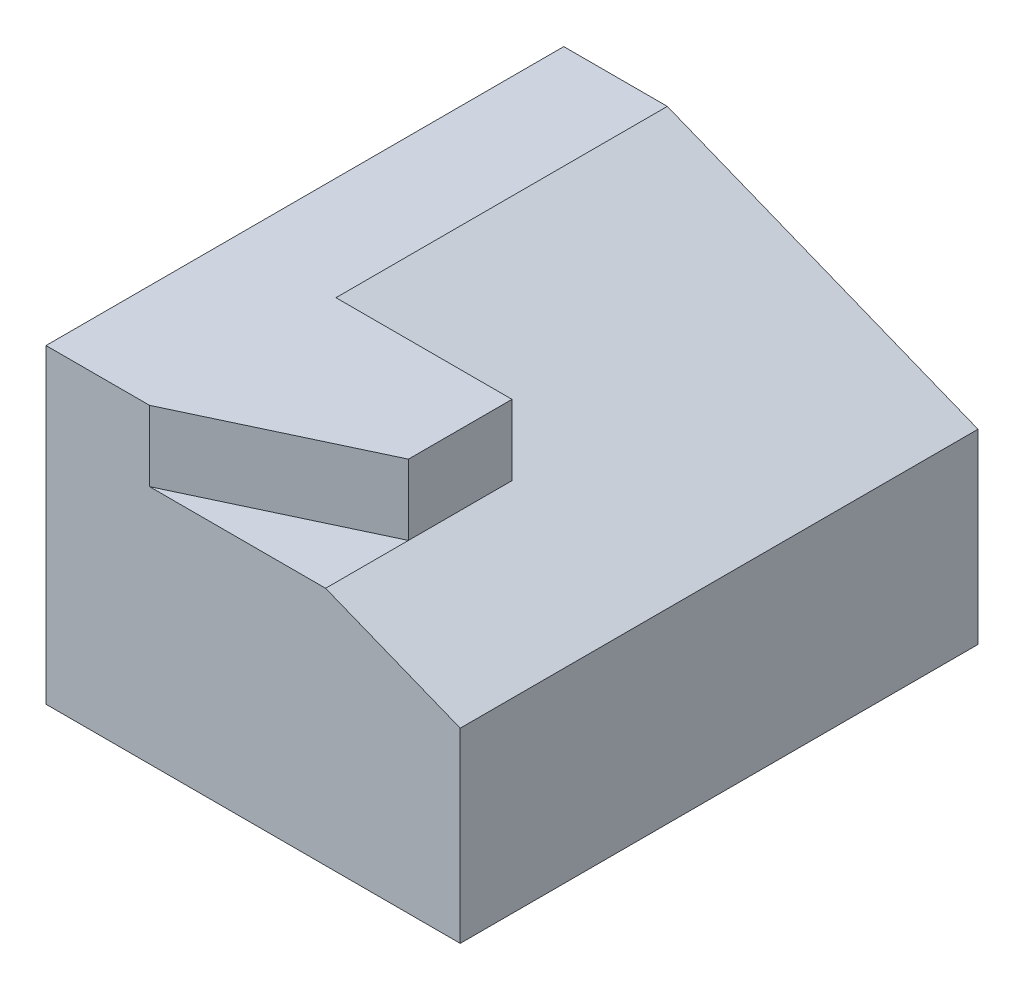
ISO-10303-21;
HEADER;
FILE_DESCRIPTION(('STEP AP214'),'2;1');
FILE_NAME('part.step','',(''),(''),'','','');
FILE_SCHEMA(('AUTOMOTIVE_DESIGN { 1 0 10303 214 1 1 1 1 }'));
ENDSEC;
DATA;
#1=APPLICATION_CONTEXT('core data for automotive mechanical design processes');
#2=APPLICATION_PROTOCOL_DEFINITION('international standard','automotive_design',2000,#1);
#3=PRODUCT_CONTEXT('',#1,'mechanical');
#4=PRODUCT('Part','Part','',(#3));
#5=PRODUCT_RELATED_PRODUCT_CATEGORY('part','',(#4));
#6=PRODUCT_DEFINITION_FORMATION('','',#4);
#7=PRODUCT_DEFINITION_CONTEXT('part definition',#1,'design');
#8=PRODUCT_DEFINITION('design','',#6,#7);
#9=PRODUCT_DEFINITION_SHAPE('','',#8);
#10=(LENGTH_UNIT() NAMED_UNIT(*) SI_UNIT(.MILLI.,.METRE.));
#11=(NAMED_UNIT(*) PLANE_ANGLE_UNIT() SI_UNIT($,.RADIAN.));
#12=(NAMED_UNIT(*) SI_UNIT($,.STERADIAN.) SOLID_ANGLE_UNIT());
#13=UNCERTAINTY_MEASURE_WITH_UNIT(LENGTH_MEASURE(1.E-05),#10,'distance_accuracy_value','');
#14=(GEOMETRIC_REPRESENTATION_CONTEXT(3) GLOBAL_UNCERTAINTY_ASSIGNED_CONTEXT((#13)) GLOBAL_UNIT_ASSIGNED_CONTEXT((#10,
#11,#12)) REPRESENTATION_CONTEXT('',''));
#15=CARTESIAN_POINT('',(0.,0.,0.));
#16=DIRECTION('',(0.,0.,1.));
#17=DIRECTION('',(1.,0.,0.));
#18=AXIS2_PLACEMENT_3D('',#15,#16,#17);
#19=CARTESIAN_POINT('',(40.,-15.,-25.));
#20=DIRECTION('',(0.,0.,1.));
#21=DIRECTION('',(1.,0.,0.));
#22=AXIS2_PLACEMENT_3D('',#19,#20,#21);
#23=PLANE('',#22);
#24=DIRECTION('',(-1.,0.,0.));
#25=VECTOR('',#24,1.);
#26=CARTESIAN_POINT('',(40.,15.,-25.));
#27=LINE('',#26,#25);
#28=CARTESIAN_POINT('',(10.,15.,-25.));
#29=VERTEX_POINT('',#28);
#30=CARTESIAN_POINT('',(0.,15.,-25.));
#31=VERTEX_POINT('',#30);
#32=EDGE_CURVE('E41',#29,#31,#27,.T.);
#33=ORIENTED_EDGE('',*,*,#32,.F.);
#34=DIRECTION('',(0.928476690885259,-0.371390676354104,0.));
#35=VECTOR('',#34,1.);
#36=CARTESIAN_POINT('',(10.,15.,-25.));
#37=LINE('',#36,#35);
#38=CARTESIAN_POINT('',(40.,3.,-25.));
#39=VERTEX_POINT('',#38);
#40=EDGE_CURVE('E124',#29,#39,#37,.T.);
#41=ORIENTED_EDGE('',*,*,#40,.T.);
#42=DIRECTION('',(0.,1.,0.));
#43=VECTOR('',#42,1.);
#44=CARTESIAN_POINT('',(40.,-15.,-25.));
#45=LINE('',#44,#43);
#46=CARTESIAN_POINT('',(40.,-15.,-25.));
#47=VERTEX_POINT('',#46);
#48=EDGE_CURVE('E101',#47,#39,#45,.T.);
#49=ORIENTED_EDGE('',*,*,#48,.F.);
#50=DIRECTION('',(-1.,0.,0.));
#51=VECTOR('',#50,1.);
#52=CARTESIAN_POINT('',(40.,-15.,-25.));
#53=LINE('',#52,#51);
#54=CARTESIAN_POINT('',(0.,-15.,-25.));
#55=VERTEX_POINT('',#54);
#56=EDGE_CURVE('E84',#47,#55,#53,.T.);
#57=ORIENTED_EDGE('',*,*,#56,.T.);
#58=DIRECTION('',(0.,1.,0.));
#59=VECTOR('',#58,1.);
#60=CARTESIAN_POINT('',(0.,-15.,-25.));
#61=LINE('',#60,#59);
#62=EDGE_CURVE('E100',#55,#31,#61,.T.);
#63=ORIENTED_EDGE('',*,*,#62,.T.);
#64=EDGE_LOOP('',(#33,#41,#49,#57,#63));
#65=FACE_BOUND('',#64,.T.);
#66=ADVANCED_FACE('F34',(#65),#23,.F.);
#67=CARTESIAN_POINT('',(40.,15.,25.));
#68=DIRECTION('',(0.,-1.,0.));
#69=DIRECTION('',(0.,0.,-1.));
#70=AXIS2_PLACEMENT_3D('',#67,#68,#69);
#71=PLANE('',#70);
#72=DIRECTION('',(-1.,0.,0.));
#73=VECTOR('',#72,1.);
#74=CARTESIAN_POINT('',(40.,15.,25.));
#75=LINE('',#74,#73);
#76=CARTESIAN_POINT('',(10.,15.,25.));
#77=VERTEX_POINT('',#76);
#78=CARTESIAN_POINT('',(0.,15.,25.));
#79=VERTEX_POINT('',#78);
#80=EDGE_CURVE('E83',#77,#79,#75,.T.);
#81=ORIENTED_EDGE('',*,*,#80,.F.);
#82=DIRECTION('',(0.904818702200994,0.,-0.42579703632988));
#83=VECTOR('',#82,1.);
#84=CARTESIAN_POINT('',(27.,15.,17.));
#85=LINE('',#84,#83);
#86=CARTESIAN_POINT('',(27.,15.,17.));
#87=VERTEX_POINT('',#86);
#88=EDGE_CURVE('E143',#77,#87,#85,.T.);
#89=ORIENTED_EDGE('',*,*,#88,.T.);
#90=DIRECTION('',(0.,0.,-1.));
#91=VECTOR('',#90,1.);
#92=CARTESIAN_POINT('',(27.,15.,7.));
#93=LINE('',#92,#91);
#94=CARTESIAN_POINT('',(27.,15.,7.));
#95=VERTEX_POINT('',#94);
#96=EDGE_CURVE('E146',#87,#95,#93,.T.);
#97=ORIENTED_EDGE('',*,*,#96,.T.);
#98=DIRECTION('',(-1.,0.,0.));
#99=VECTOR('',#98,1.);
#100=CARTESIAN_POINT('',(10.,15.,7.));
#101=LINE('',#100,#99);
#102=CARTESIAN_POINT('',(10.,15.,7.));
#103=VERTEX_POINT('',#102);
#104=EDGE_CURVE('E142',#95,#103,#101,.T.);
#105=ORIENTED_EDGE('',*,*,#104,.T.);
#106=DIRECTION('',(0.,0.,1.));
#107=VECTOR('',#106,1.);
#108=CARTESIAN_POINT('',(10.,15.,-25.));
#109=LINE('',#108,#107);
#110=EDGE_CURVE('E114',#29,#103,#109,.T.);
#111=ORIENTED_EDGE('',*,*,#110,.F.);
#112=ORIENTED_EDGE('',*,*,#32,.T.);
#113=DIRECTION('',(0.,0.,1.));
#114=VECTOR('',#113,1.);
#115=CARTESIAN_POINT('',(0.,15.,25.));
#116=LINE('',#115,#114);
#117=EDGE_CURVE('E95',#31,#79,#116,.T.);
#118=ORIENTED_EDGE('',*,*,#117,.T.);
#119=EDGE_LOOP('',(#81,#89,#97,#105,#111,#112,#118));
#120=FACE_BOUND('',#119,.T.);
#121=ADVANCED_FACE('F110',(#120),#71,.F.);
#122=CARTESIAN_POINT('',(40.,-15.,25.));
#123=DIRECTION('',(0.,0.,-1.));
#124=DIRECTION('',(-1.,0.,0.));
#125=AXIS2_PLACEMENT_3D('',#122,#123,#124);
#126=PLANE('',#125);
#127=DIRECTION('',(1.,0.,0.));
#128=VECTOR('',#127,1.);
#129=CARTESIAN_POINT('',(10.,8.2,25.));
#130=LINE('',#129,#128);
#131=CARTESIAN_POINT('',(10.,8.2,25.));
#132=VERTEX_POINT('',#131);
#133=CARTESIAN_POINT('',(27.,8.2,25.));
#134=VERTEX_POINT('',#133);
#135=EDGE_CURVE('E131',#132,#134,#130,.T.);
#136=ORIENTED_EDGE('',*,*,#135,.F.);
#137=DIRECTION('',(0.,-1.,0.));
#138=VECTOR('',#137,1.);
#139=CARTESIAN_POINT('',(10.,15.,25.));
#140=LINE('',#139,#138);
#141=EDGE_CURVE('E134',#77,#132,#140,.T.);
#142=ORIENTED_EDGE('',*,*,#141,.F.);
#143=ORIENTED_EDGE('',*,*,#80,.T.);
#144=DIRECTION('',(0.,-1.,0.));
#145=VECTOR('',#144,1.);
#146=CARTESIAN_POINT('',(0.,-15.,25.));
#147=LINE('',#146,#145);
#148=CARTESIAN_POINT('',(0.,-15.,25.));
#149=VERTEX_POINT('',#148);
#150=EDGE_CURVE('E87',#79,#149,#147,.T.);
#151=ORIENTED_EDGE('',*,*,#150,.T.);
#152=DIRECTION('',(-1.,0.,0.));
#153=VECTOR('',#152,1.);
#154=CARTESIAN_POINT('',(40.,-15.,25.));
#155=LINE('',#154,#153);
#156=CARTESIAN_POINT('',(40.,-15.,25.));
#157=VERTEX_POINT('',#156);
#158=EDGE_CURVE('E74',#157,#149,#155,.T.);
#159=ORIENTED_EDGE('',*,*,#158,.F.);
#160=DIRECTION('',(0.,-1.,0.));
#161=VECTOR('',#160,1.);
#162=CARTESIAN_POINT('',(40.,23.9732321180382,25.));
#163=LINE('',#162,#161);
#164=CARTESIAN_POINT('',(40.,3.,25.));
#165=VERTEX_POINT('',#164);
#166=EDGE_CURVE('E151',#165,#157,#163,.T.);
#167=ORIENTED_EDGE('',*,*,#166,.F.);
#168=DIRECTION('',(0.928476690885259,-0.371390676354104,0.));
#169=VECTOR('',#168,1.);
#170=CARTESIAN_POINT('',(32.7678509937799,5.89285960248802,25.));
#171=LINE('',#170,#169);
#172=EDGE_CURVE('E147',#134,#165,#171,.T.);
#173=ORIENTED_EDGE('',*,*,#172,.F.);
#174=EDGE_LOOP('',(#136,#142,#143,#151,#159,#167,#173));
#175=FACE_BOUND('',#174,.T.);
#176=ADVANCED_FACE('F89',(#175),#126,.F.);
#177=CARTESIAN_POINT('',(40.,-15.,25.));
#178=DIRECTION('',(0.,1.,0.));
#179=DIRECTION('',(0.,0.,1.));
#180=AXIS2_PLACEMENT_3D('',#177,#178,#179);
#181=PLANE('',#180);
#182=DIRECTION('',(0.,0.,-1.));
#183=VECTOR('',#182,1.);
#184=CARTESIAN_POINT('',(40.,-15.,25.));
#185=LINE('',#184,#183);
#186=EDGE_CURVE('E57',#157,#47,#185,.T.);
#187=ORIENTED_EDGE('',*,*,#186,.F.);
#188=ORIENTED_EDGE('',*,*,#158,.T.);
#189=DIRECTION('',(0.,0.,-1.));
#190=VECTOR('',#189,1.);
#191=CARTESIAN_POINT('',(0.,-15.,25.));
#192=LINE('',#191,#190);
#193=EDGE_CURVE('E78',#149,#55,#192,.T.);
#194=ORIENTED_EDGE('',*,*,#193,.T.);
#195=ORIENTED_EDGE('',*,*,#56,.F.);
#196=EDGE_LOOP('',(#187,#188,#194,#195));
#197=FACE_BOUND('',#196,.T.);
#198=ADVANCED_FACE('F76',(#197),#181,.F.);
#199=CARTESIAN_POINT('',(40.,0.,0.));
#200=DIRECTION('',(-1.,0.,0.));
#201=DIRECTION('',(0.,0.,1.));
#202=AXIS2_PLACEMENT_3D('',#199,#200,#201);
#203=PLANE('',#202);
#204=DIRECTION('',(0.,0.,1.));
#205=VECTOR('',#204,1.);
#206=CARTESIAN_POINT('',(40.,3.,-25.));
#207=LINE('',#206,#205);
#208=EDGE_CURVE('E118',#39,#165,#207,.T.);
#209=ORIENTED_EDGE('',*,*,#208,.T.);
#210=ORIENTED_EDGE('',*,*,#166,.T.);
#211=ORIENTED_EDGE('',*,*,#186,.T.);
#212=ORIENTED_EDGE('',*,*,#48,.T.);
#213=EDGE_LOOP('',(#209,#210,#211,#212));
#214=FACE_BOUND('',#213,.T.);
#215=ADVANCED_FACE('F165',(#214),#203,.F.);
#216=CARTESIAN_POINT('',(0.,0.,0.));
#217=DIRECTION('',(-1.,0.,0.));
#218=DIRECTION('',(0.,0.,1.));
#219=AXIS2_PLACEMENT_3D('',#216,#217,#218);
#220=PLANE('',#219);
#221=ORIENTED_EDGE('',*,*,#62,.F.);
#222=ORIENTED_EDGE('',*,*,#193,.F.);
#223=ORIENTED_EDGE('',*,*,#150,.F.);
#224=ORIENTED_EDGE('',*,*,#117,.F.);
#225=EDGE_LOOP('',(#221,#222,#223,#224));
#226=FACE_BOUND('',#225,.T.);
#227=ADVANCED_FACE('F98',(#226),#220,.T.);
#228=CARTESIAN_POINT('',(10.,15.,-25.));
#229=DIRECTION('',(-0.371390676354104,-0.928476690885259,0.));
#230=DIRECTION('',(0.928476690885259,-0.371390676354104,0.));
#231=AXIS2_PLACEMENT_3D('',#228,#229,#230);
#232=PLANE('',#231);
#233=DIRECTION('',(-0.928476690885259,0.371390676354104,0.));
#234=VECTOR('',#233,1.);
#235=CARTESIAN_POINT('',(10.,15.,7.));
#236=LINE('',#235,#234);
#237=CARTESIAN_POINT('',(27.,8.2,7.));
#238=VERTEX_POINT('',#237);
#239=EDGE_CURVE('E11',#238,#103,#236,.T.);
#240=ORIENTED_EDGE('',*,*,#239,.F.);
#241=DIRECTION('',(0.,0.,1.));
#242=VECTOR('',#241,1.);
#243=CARTESIAN_POINT('',(27.,8.2,7.));
#244=LINE('',#243,#242);
#245=CARTESIAN_POINT('',(27.,8.2,17.));
#246=VERTEX_POINT('',#245);
#247=EDGE_CURVE('E127',#238,#246,#244,.T.);
#248=ORIENTED_EDGE('',*,*,#247,.T.);
#249=EDGE_CURVE('E130',#246,#134,#244,.T.);
#250=ORIENTED_EDGE('',*,*,#249,.T.);
#251=ORIENTED_EDGE('',*,*,#172,.T.);
#252=ORIENTED_EDGE('',*,*,#208,.F.);
#253=ORIENTED_EDGE('',*,*,#40,.F.);
#254=ORIENTED_EDGE('',*,*,#110,.T.);
#255=EDGE_LOOP('',(#240,#248,#250,#251,#252,#253,#254));
#256=FACE_BOUND('',#255,.T.);
#257=ADVANCED_FACE('F160',(#256),#232,.F.);
#258=CARTESIAN_POINT('',(10.,8.2,7.));
#259=DIRECTION('',(0.,-1.,0.));
#260=DIRECTION('',(0.,0.,-1.));
#261=AXIS2_PLACEMENT_3D('',#258,#259,#260);
#262=PLANE('',#261);
#263=ORIENTED_EDGE('',*,*,#249,.F.);
#264=DIRECTION('',(0.904818702200994,0.,-0.42579703632988));
#265=VECTOR('',#264,1.);
#266=CARTESIAN_POINT('',(27.,8.2,17.));
#267=LINE('',#266,#265);
#268=EDGE_CURVE('E48',#132,#246,#267,.T.);
#269=ORIENTED_EDGE('',*,*,#268,.F.);
#270=ORIENTED_EDGE('',*,*,#135,.T.);
#271=EDGE_LOOP('',(#263,#269,#270));
#272=FACE_BOUND('',#271,.T.);
#273=ADVANCED_FACE('F190',(#272),#262,.F.);
#274=CARTESIAN_POINT('',(10.,-16.5588368062799,7.));
#275=DIRECTION('',(0.,0.,-1.));
#276=DIRECTION('',(-1.,0.,0.));
#277=AXIS2_PLACEMENT_3D('',#274,#275,#276);
#278=PLANE('',#277);
#279=ORIENTED_EDGE('',*,*,#239,.T.);
#280=ORIENTED_EDGE('',*,*,#104,.F.);
#281=DIRECTION('',(0.,1.,0.));
#282=VECTOR('',#281,1.);
#283=CARTESIAN_POINT('',(27.,-16.5588368062799,7.));
#284=LINE('',#283,#282);
#285=EDGE_CURVE('E136',#238,#95,#284,.T.);
#286=ORIENTED_EDGE('',*,*,#285,.F.);
#287=EDGE_LOOP('',(#279,#280,#286));
#288=FACE_BOUND('',#287,.T.);
#289=ADVANCED_FACE('F185',(#288),#278,.T.);
#290=CARTESIAN_POINT('',(27.,-16.5588368062799,17.));
#291=DIRECTION('',(0.42579703632988,0.,0.904818702200994));
#292=DIRECTION('',(0.904818702200994,0.,-0.42579703632988));
#293=AXIS2_PLACEMENT_3D('',#290,#291,#292);
#294=PLANE('',#293);
#295=ORIENTED_EDGE('',*,*,#141,.T.);
#296=ORIENTED_EDGE('',*,*,#268,.T.);
#297=DIRECTION('',(0.,1.,0.));
#298=VECTOR('',#297,1.);
#299=CARTESIAN_POINT('',(27.,-16.5588368062799,17.));
#300=LINE('',#299,#298);
#301=EDGE_CURVE('E137',#246,#87,#300,.T.);
#302=ORIENTED_EDGE('',*,*,#301,.T.);
#303=ORIENTED_EDGE('',*,*,#88,.F.);
#304=EDGE_LOOP('',(#295,#296,#302,#303));
#305=FACE_BOUND('',#304,.T.);
#306=ADVANCED_FACE('F191',(#305),#294,.T.);
#307=CARTESIAN_POINT('',(27.,-16.5588368062799,7.));
#308=DIRECTION('',(1.,0.,0.));
#309=DIRECTION('',(0.,0.,-1.));
#310=AXIS2_PLACEMENT_3D('',#307,#308,#309);
#311=PLANE('',#310);
#312=ORIENTED_EDGE('',*,*,#301,.F.);
#313=ORIENTED_EDGE('',*,*,#247,.F.);
#314=ORIENTED_EDGE('',*,*,#285,.T.);
#315=ORIENTED_EDGE('',*,*,#96,.F.);
#316=EDGE_LOOP('',(#312,#313,#314,#315));
#317=FACE_BOUND('',#316,.T.);
#318=ADVANCED_FACE('F188',(#317),#311,.T.);
#319=CLOSED_SHELL('',(#66,#121,#176,#198,#215,#227,#257,#273,#289,#306,#318));
#320=MANIFOLD_SOLID_BREP('B2',#319);
#321=ADVANCED_BREP_SHAPE_REPRESENTATION('',(#18,#320),#14);
#322=SHAPE_DEFINITION_REPRESENTATION(#9,#321);
ENDSEC;
END-ISO-10303-21;
